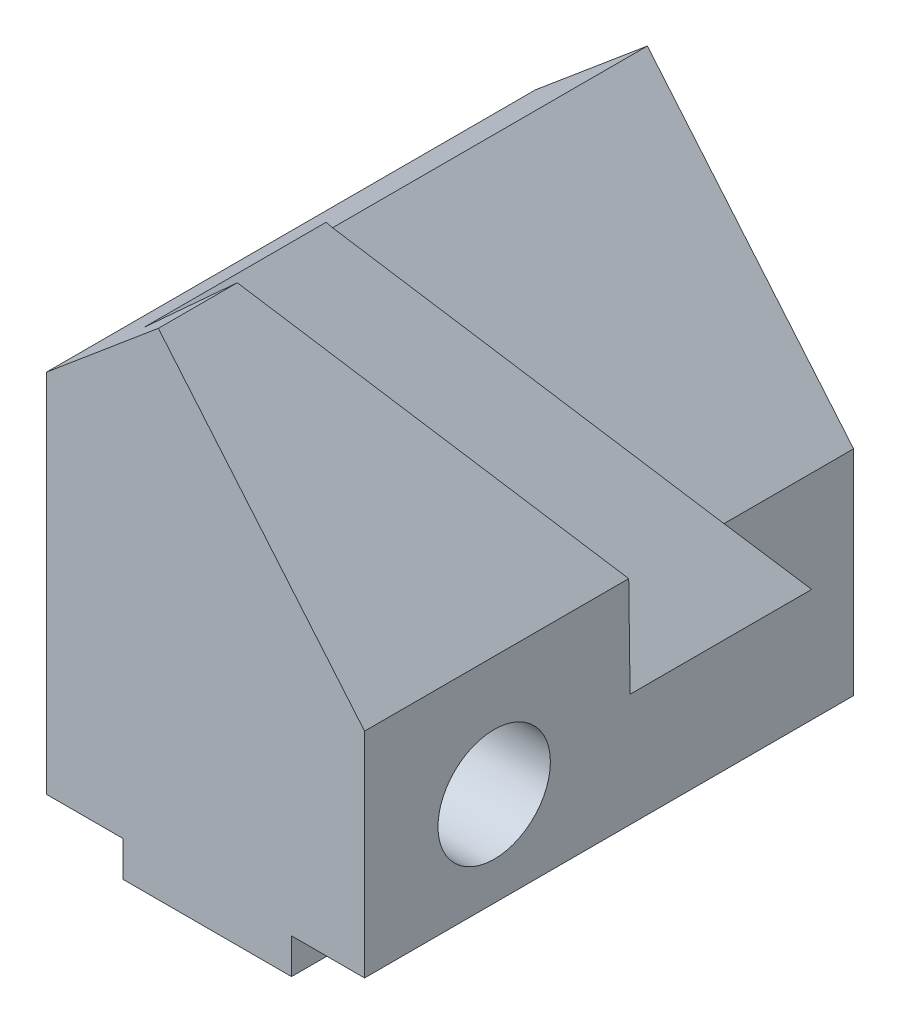
ISO-10303-21;
HEADER;
FILE_DESCRIPTION(('STEP AP214'),'2;1');
FILE_NAME('part.step','',(''),(''),'','','');
FILE_SCHEMA(('AUTOMOTIVE_DESIGN { 1 0 10303 214 1 1 1 1 }'));
ENDSEC;
DATA;
#1=APPLICATION_CONTEXT('core data for automotive mechanical design processes');
#2=APPLICATION_PROTOCOL_DEFINITION('international standard','automotive_design',2000,#1);
#3=PRODUCT_CONTEXT('',#1,'mechanical');
#4=PRODUCT('Part','Part','',(#3));
#5=PRODUCT_RELATED_PRODUCT_CATEGORY('part','',(#4));
#6=PRODUCT_DEFINITION_FORMATION('','',#4);
#7=PRODUCT_DEFINITION_CONTEXT('part definition',#1,'design');
#8=PRODUCT_DEFINITION('design','',#6,#7);
#9=PRODUCT_DEFINITION_SHAPE('','',#8);
#10=(LENGTH_UNIT() NAMED_UNIT(*) SI_UNIT(.MILLI.,.METRE.));
#11=(NAMED_UNIT(*) PLANE_ANGLE_UNIT() SI_UNIT($,.RADIAN.));
#12=(NAMED_UNIT(*) SI_UNIT($,.STERADIAN.) SOLID_ANGLE_UNIT());
#13=UNCERTAINTY_MEASURE_WITH_UNIT(LENGTH_MEASURE(1.E-05),#10,'distance_accuracy_value','');
#14=(GEOMETRIC_REPRESENTATION_CONTEXT(3) GLOBAL_UNCERTAINTY_ASSIGNED_CONTEXT((#13)) GLOBAL_UNIT_ASSIGNED_CONTEXT((#10,
#11,#12)) REPRESENTATION_CONTEXT('',''));
#15=CARTESIAN_POINT('',(0.,0.,0.));
#16=DIRECTION('',(0.,0.,1.));
#17=DIRECTION('',(1.,0.,0.));
#18=AXIS2_PLACEMENT_3D('',#15,#16,#17);
#19=CARTESIAN_POINT('',(-8.00000000000001,84.,0.));
#20=DIRECTION('',(-0.766044443118974,-0.642787609686544,0.));
#21=DIRECTION('',(0.642787609686544,-0.766044443118974,0.));
#22=AXIS2_PLACEMENT_3D('',#19,#20,#21);
#23=PLANE('',#22);
#24=DIRECTION('',(0.,0.,1.));
#25=VECTOR('',#24,1.);
#26=CARTESIAN_POINT('',(27.,42.2886242592031,0.));
#27=LINE('',#26,#25);
#28=CARTESIAN_POINT('',(27.,42.2886242592031,38.1658075373095));
#29=VERTEX_POINT('',#28);
#30=CARTESIAN_POINT('',(27.,42.2886242592031,83.));
#31=VERTEX_POINT('',#30);
#32=EDGE_CURVE('E170',#29,#31,#27,.T.);
#33=ORIENTED_EDGE('',*,*,#32,.F.);
#34=DIRECTION('',(-0.556670399226425,0.663413948168938,0.499999999999995));
#35=VECTOR('',#34,1.);
#36=CARTESIAN_POINT('',(11.3728876592962,60.91229153311,52.2020418713245));
#37=LINE('',#36,#35);
#38=CARTESIAN_POINT('',(-8.00000000000004,84.,69.6027224950989));
#39=VERTEX_POINT('',#38);
#40=EDGE_CURVE('E48',#29,#39,#37,.T.);
#41=ORIENTED_EDGE('',*,*,#40,.T.);
#42=DIRECTION('',(0.,0.,1.));
#43=VECTOR('',#42,1.);
#44=CARTESIAN_POINT('',(-8.00000000000001,84.,0.));
#45=LINE('',#44,#43);
#46=CARTESIAN_POINT('',(-8.00000000000001,84.,83.));
#47=VERTEX_POINT('',#46);
#48=EDGE_CURVE('E184',#39,#47,#45,.T.);
#49=ORIENTED_EDGE('',*,*,#48,.T.);
#50=DIRECTION('',(0.642787609686544,-0.766044443118974,0.));
#51=VECTOR('',#50,1.);
#52=CARTESIAN_POINT('',(-8.00000000000001,84.,83.));
#53=LINE('',#52,#51);
#54=EDGE_CURVE('E168',#47,#31,#53,.T.);
#55=ORIENTED_EDGE('',*,*,#54,.T.);
#56=EDGE_LOOP('',(#33,#41,#49,#55));
#57=FACE_BOUND('',#56,.T.);
#58=ADVANCED_FACE('F40',(#57),#23,.F.);
#59=CARTESIAN_POINT('',(14.6,0.,83.));
#60=DIRECTION('',(-1.,0.,0.));
#61=DIRECTION('',(0.,0.,1.));
#62=AXIS2_PLACEMENT_3D('',#59,#60,#61);
#63=PLANE('',#62);
#64=DIRECTION('',(0.,1.,0.));
#65=VECTOR('',#64,1.);
#66=CARTESIAN_POINT('',(14.6,0.,0.));
#67=LINE('',#66,#65);
#68=CARTESIAN_POINT('',(14.6,0.,0.));
#69=VERTEX_POINT('',#68);
#70=CARTESIAN_POINT('',(14.6,5.99999999999999,0.));
#71=VERTEX_POINT('',#70);
#72=EDGE_CURVE('E183',#69,#71,#67,.T.);
#73=ORIENTED_EDGE('',*,*,#72,.T.);
#74=DIRECTION('',(0.,0.,-1.));
#75=VECTOR('',#74,1.);
#76=CARTESIAN_POINT('',(14.6,5.99999999999999,83.));
#77=LINE('',#76,#75);
#78=CARTESIAN_POINT('',(14.6,5.99999999999999,83.));
#79=VERTEX_POINT('',#78);
#80=EDGE_CURVE('E231',#79,#71,#77,.T.);
#81=ORIENTED_EDGE('',*,*,#80,.F.);
#82=DIRECTION('',(0.,1.,0.));
#83=VECTOR('',#82,1.);
#84=CARTESIAN_POINT('',(14.6,0.,83.));
#85=LINE('',#84,#83);
#86=CARTESIAN_POINT('',(14.6,0.,83.));
#87=VERTEX_POINT('',#86);
#88=EDGE_CURVE('E186',#87,#79,#85,.T.);
#89=ORIENTED_EDGE('',*,*,#88,.F.);
#90=DIRECTION('',(0.,0.,-1.));
#91=VECTOR('',#90,1.);
#92=CARTESIAN_POINT('',(14.6,0.,83.));
#93=LINE('',#92,#91);
#94=EDGE_CURVE('E203',#87,#69,#93,.T.);
#95=ORIENTED_EDGE('',*,*,#94,.T.);
#96=EDGE_LOOP('',(#73,#81,#89,#95));
#97=FACE_BOUND('',#96,.T.);
#98=ADVANCED_FACE('F42',(#97),#63,.F.);
#99=CARTESIAN_POINT('',(14.6,5.99999999999999,83.));
#100=DIRECTION('',(0.,1.,0.));
#101=DIRECTION('',(-1.,0.,0.));
#102=AXIS2_PLACEMENT_3D('',#99,#100,#101);
#103=PLANE('',#102);
#104=DIRECTION('',(1.,0.,0.));
#105=VECTOR('',#104,1.);
#106=CARTESIAN_POINT('',(14.6,5.99999999999999,0.));
#107=LINE('',#106,#105);
#108=CARTESIAN_POINT('',(27.,6.00000000000001,0.));
#109=VERTEX_POINT('',#108);
#110=EDGE_CURVE('E206',#71,#109,#107,.T.);
#111=ORIENTED_EDGE('',*,*,#110,.T.);
#112=DIRECTION('',(0.,0.,-1.));
#113=VECTOR('',#112,1.);
#114=CARTESIAN_POINT('',(27.,6.00000000000001,83.));
#115=LINE('',#114,#113);
#116=CARTESIAN_POINT('',(27.,6.00000000000001,83.));
#117=VERTEX_POINT('',#116);
#118=EDGE_CURVE('E228',#117,#109,#115,.T.);
#119=ORIENTED_EDGE('',*,*,#118,.F.);
#120=DIRECTION('',(1.,0.,0.));
#121=VECTOR('',#120,1.);
#122=CARTESIAN_POINT('',(14.6,5.99999999999999,83.));
#123=LINE('',#122,#121);
#124=EDGE_CURVE('E189',#79,#117,#123,.T.);
#125=ORIENTED_EDGE('',*,*,#124,.F.);
#126=ORIENTED_EDGE('',*,*,#80,.T.);
#127=EDGE_LOOP('',(#111,#119,#125,#126));
#128=FACE_BOUND('',#127,.T.);
#129=ADVANCED_FACE('F274',(#128),#103,.F.);
#130=CARTESIAN_POINT('',(27.,6.00000000000001,83.));
#131=DIRECTION('',(-1.,0.,0.));
#132=DIRECTION('',(0.,-1.,0.));
#133=AXIS2_PLACEMENT_3D('',#130,#131,#132);
#134=PLANE('',#133);
#135=CARTESIAN_POINT('',(27.,22.,61.));
#136=DIRECTION('',(1.,0.,0.));
#137=DIRECTION('',(0.,0.,-1.));
#138=AXIS2_PLACEMENT_3D('',#135,#136,#137);
#139=CIRCLE('',#138,9.537499975);
#140=CARTESIAN_POINT('',(27.,22.,51.462500025));
#141=VERTEX_POINT('',#140);
#142=EDGE_CURVE('E145',#141,#141,#139,.T.);
#143=ORIENTED_EDGE('',*,*,#142,.F.);
#144=EDGE_LOOP('',(#143));
#145=FACE_BOUND('',#144,.T.);
#146=DIRECTION('',(0.,0.,1.));
#147=VECTOR('',#146,1.);
#148=CARTESIAN_POINT('',(27.,25.1756621637388,83.));
#149=LINE('',#148,#147);
#150=CARTESIAN_POINT('',(27.,25.1756621637388,7.0980148342552));
#151=VERTEX_POINT('',#150);
#152=CARTESIAN_POINT('',(27.,25.1756621637388,37.9304890382314));
#153=VERTEX_POINT('',#152);
#154=EDGE_CURVE('E138',#151,#153,#149,.T.);
#155=ORIENTED_EDGE('',*,*,#154,.T.);
#156=DIRECTION('',(0.,0.999905469885784,0.0137495924481631));
#157=VECTOR('',#156,1.);
#158=CARTESIAN_POINT('',(27.,6.62325401215735,37.6753768714329));
#159=LINE('',#158,#157);
#160=EDGE_CURVE('E146',#153,#29,#159,.T.);
#161=ORIENTED_EDGE('',*,*,#160,.T.);
#162=ORIENTED_EDGE('',*,*,#32,.T.);
#163=DIRECTION('',(0.,1.,0.));
#164=VECTOR('',#163,1.);
#165=CARTESIAN_POINT('',(27.,6.00000000000001,83.));
#166=LINE('',#165,#164);
#167=EDGE_CURVE('E192',#117,#31,#166,.T.);
#168=ORIENTED_EDGE('',*,*,#167,.F.);
#169=ORIENTED_EDGE('',*,*,#118,.T.);
#170=DIRECTION('',(0.,1.,0.));
#171=VECTOR('',#170,1.);
#172=CARTESIAN_POINT('',(27.,6.00000000000001,0.));
#173=LINE('',#172,#171);
#174=CARTESIAN_POINT('',(27.,42.2886242592031,0.));
#175=VERTEX_POINT('',#174);
#176=EDGE_CURVE('E208',#109,#175,#173,.T.);
#177=ORIENTED_EDGE('',*,*,#176,.T.);
#178=CARTESIAN_POINT('',(27.,42.2886242592031,22.));
#179=VERTEX_POINT('',#178);
#180=EDGE_CURVE('E155',#175,#179,#27,.T.);
#181=ORIENTED_EDGE('',*,*,#180,.T.);
#182=DIRECTION('',(0.,-0.754143856540743,-0.656709253507102));
#183=VECTOR('',#182,1.);
#184=CARTESIAN_POINT('',(27.,51.8605358951128,30.3352305936534));
#185=LINE('',#184,#183);
#186=EDGE_CURVE('E55',#179,#151,#185,.T.);
#187=ORIENTED_EDGE('',*,*,#186,.T.);
#188=EDGE_LOOP('',(#155,#161,#162,#168,#169,#177,#181,#187));
#189=FACE_BOUND('',#188,.T.);
#190=ADVANCED_FACE('F153',(#145,#189),#134,.F.);
#191=CARTESIAN_POINT('',(-27.,6.,83.));
#192=DIRECTION('',(1.,0.,0.));
#193=DIRECTION('',(0.,1.,0.));
#194=AXIS2_PLACEMENT_3D('',#191,#192,#193);
#195=PLANE('',#194);
#196=CARTESIAN_POINT('',(-27.,22.,61.));
#197=DIRECTION('',(1.,0.,0.));
#198=DIRECTION('',(0.,0.,-1.));
#199=AXIS2_PLACEMENT_3D('',#196,#197,#198);
#200=CIRCLE('',#199,9.53749997499999);
#201=CARTESIAN_POINT('',(-27.,22.,51.462500025));
#202=VERTEX_POINT('',#201);
#203=EDGE_CURVE('E165',#202,#202,#200,.T.);
#204=ORIENTED_EDGE('',*,*,#203,.T.);
#205=EDGE_LOOP('',(#204));
#206=FACE_BOUND('',#205,.T.);
#207=DIRECTION('',(0.,-1.,0.));
#208=VECTOR('',#207,1.);
#209=CARTESIAN_POINT('',(-27.,6.,83.));
#210=LINE('',#209,#208);
#211=CARTESIAN_POINT('',(-27.,68.0571070076319,83.));
#212=VERTEX_POINT('',#211);
#213=CARTESIAN_POINT('',(-27.,6.,83.));
#214=VERTEX_POINT('',#213);
#215=EDGE_CURVE('E195',#212,#214,#210,.T.);
#216=ORIENTED_EDGE('',*,*,#215,.F.);
#217=DIRECTION('',(0.,0.,1.));
#218=VECTOR('',#217,1.);
#219=CARTESIAN_POINT('',(-27.,68.0571070076319,0.));
#220=LINE('',#219,#218);
#221=CARTESIAN_POINT('',(-27.,68.0571070076319,0.));
#222=VERTEX_POINT('',#221);
#223=EDGE_CURVE('E178',#222,#212,#220,.T.);
#224=ORIENTED_EDGE('',*,*,#223,.F.);
#225=DIRECTION('',(0.,-1.,0.));
#226=VECTOR('',#225,1.);
#227=CARTESIAN_POINT('',(-27.,6.,0.));
#228=LINE('',#227,#226);
#229=CARTESIAN_POINT('',(-27.,6.,0.));
#230=VERTEX_POINT('',#229);
#231=EDGE_CURVE('E210',#222,#230,#228,.T.);
#232=ORIENTED_EDGE('',*,*,#231,.T.);
#233=DIRECTION('',(0.,0.,-1.));
#234=VECTOR('',#233,1.);
#235=CARTESIAN_POINT('',(-27.,6.,83.));
#236=LINE('',#235,#234);
#237=EDGE_CURVE('E225',#214,#230,#236,.T.);
#238=ORIENTED_EDGE('',*,*,#237,.F.);
#239=EDGE_LOOP('',(#216,#224,#232,#238));
#240=FACE_BOUND('',#239,.T.);
#241=ADVANCED_FACE('F250',(#206,#240),#195,.F.);
#242=CARTESIAN_POINT('',(-14.,6.,83.));
#243=DIRECTION('',(0.,1.,0.));
#244=DIRECTION('',(-1.,0.,0.));
#245=AXIS2_PLACEMENT_3D('',#242,#243,#244);
#246=PLANE('',#245);
#247=DIRECTION('',(1.,0.,0.));
#248=VECTOR('',#247,1.);
#249=CARTESIAN_POINT('',(-14.,6.,0.));
#250=LINE('',#249,#248);
#251=CARTESIAN_POINT('',(-14.,6.,0.));
#252=VERTEX_POINT('',#251);
#253=EDGE_CURVE('E212',#230,#252,#250,.T.);
#254=ORIENTED_EDGE('',*,*,#253,.T.);
#255=DIRECTION('',(0.,0.,-1.));
#256=VECTOR('',#255,1.);
#257=CARTESIAN_POINT('',(-14.,6.,83.));
#258=LINE('',#257,#256);
#259=CARTESIAN_POINT('',(-14.,6.,83.));
#260=VERTEX_POINT('',#259);
#261=EDGE_CURVE('E222',#260,#252,#258,.T.);
#262=ORIENTED_EDGE('',*,*,#261,.F.);
#263=DIRECTION('',(1.,0.,0.));
#264=VECTOR('',#263,1.);
#265=CARTESIAN_POINT('',(-14.,6.,83.));
#266=LINE('',#265,#264);
#267=EDGE_CURVE('E197',#214,#260,#266,.T.);
#268=ORIENTED_EDGE('',*,*,#267,.F.);
#269=ORIENTED_EDGE('',*,*,#237,.T.);
#270=EDGE_LOOP('',(#254,#262,#268,#269));
#271=FACE_BOUND('',#270,.T.);
#272=ADVANCED_FACE('F256',(#271),#246,.F.);
#273=CARTESIAN_POINT('',(-14.,0.,83.));
#274=DIRECTION('',(1.,0.,0.));
#275=DIRECTION('',(0.,0.,-1.));
#276=AXIS2_PLACEMENT_3D('',#273,#274,#275);
#277=PLANE('',#276);
#278=DIRECTION('',(0.,-1.,0.));
#279=VECTOR('',#278,1.);
#280=CARTESIAN_POINT('',(-14.,0.,0.));
#281=LINE('',#280,#279);
#282=CARTESIAN_POINT('',(-14.,0.,0.));
#283=VERTEX_POINT('',#282);
#284=EDGE_CURVE('E214',#252,#283,#281,.T.);
#285=ORIENTED_EDGE('',*,*,#284,.T.);
#286=DIRECTION('',(0.,0.,-1.));
#287=VECTOR('',#286,1.);
#288=CARTESIAN_POINT('',(-14.,0.,83.));
#289=LINE('',#288,#287);
#290=CARTESIAN_POINT('',(-14.,0.,83.));
#291=VERTEX_POINT('',#290);
#292=EDGE_CURVE('E219',#291,#283,#289,.T.);
#293=ORIENTED_EDGE('',*,*,#292,.F.);
#294=DIRECTION('',(0.,-1.,0.));
#295=VECTOR('',#294,1.);
#296=CARTESIAN_POINT('',(-14.,0.,83.));
#297=LINE('',#296,#295);
#298=EDGE_CURVE('E199',#260,#291,#297,.T.);
#299=ORIENTED_EDGE('',*,*,#298,.F.);
#300=ORIENTED_EDGE('',*,*,#261,.T.);
#301=EDGE_LOOP('',(#285,#293,#299,#300));
#302=FACE_BOUND('',#301,.T.);
#303=ADVANCED_FACE('F262',(#302),#277,.F.);
#304=CARTESIAN_POINT('',(14.6,0.,83.));
#305=DIRECTION('',(0.,1.,0.));
#306=DIRECTION('',(-1.,0.,0.));
#307=AXIS2_PLACEMENT_3D('',#304,#305,#306);
#308=PLANE('',#307);
#309=DIRECTION('',(1.,0.,0.));
#310=VECTOR('',#309,1.);
#311=CARTESIAN_POINT('',(14.6,0.,0.));
#312=LINE('',#311,#310);
#313=EDGE_CURVE('E190',#283,#69,#312,.T.);
#314=ORIENTED_EDGE('',*,*,#313,.T.);
#315=ORIENTED_EDGE('',*,*,#94,.F.);
#316=DIRECTION('',(1.,0.,0.));
#317=VECTOR('',#316,1.);
#318=CARTESIAN_POINT('',(14.6,0.,83.));
#319=LINE('',#318,#317);
#320=EDGE_CURVE('E201',#291,#87,#319,.T.);
#321=ORIENTED_EDGE('',*,*,#320,.F.);
#322=ORIENTED_EDGE('',*,*,#292,.T.);
#323=EDGE_LOOP('',(#314,#315,#321,#322));
#324=FACE_BOUND('',#323,.T.);
#325=ADVANCED_FACE('F266',(#324),#308,.F.);
#326=CARTESIAN_POINT('',(0.,0.,83.));
#327=DIRECTION('',(0.,0.,-1.));
#328=DIRECTION('',(-1.,0.,0.));
#329=AXIS2_PLACEMENT_3D('',#326,#327,#328);
#330=PLANE('',#329);
#331=ORIENTED_EDGE('',*,*,#167,.T.);
#332=ORIENTED_EDGE('',*,*,#54,.F.);
#333=DIRECTION('',(0.766044443118981,0.642787609686535,0.));
#334=VECTOR('',#333,1.);
#335=CARTESIAN_POINT('',(-8.00000000000001,84.,83.));
#336=LINE('',#335,#334);
#337=EDGE_CURVE('E174',#212,#47,#336,.T.);
#338=ORIENTED_EDGE('',*,*,#337,.F.);
#339=ORIENTED_EDGE('',*,*,#215,.T.);
#340=ORIENTED_EDGE('',*,*,#267,.T.);
#341=ORIENTED_EDGE('',*,*,#298,.T.);
#342=ORIENTED_EDGE('',*,*,#320,.T.);
#343=ORIENTED_EDGE('',*,*,#88,.T.);
#344=ORIENTED_EDGE('',*,*,#124,.T.);
#345=EDGE_LOOP('',(#331,#332,#338,#339,#340,#341,#342,#343,#344));
#346=FACE_BOUND('',#345,.T.);
#347=ADVANCED_FACE('F247',(#346),#330,.F.);
#348=CARTESIAN_POINT('',(0.,0.,0.));
#349=DIRECTION('',(0.,0.,-1.));
#350=DIRECTION('',(-1.,0.,0.));
#351=AXIS2_PLACEMENT_3D('',#348,#349,#350);
#352=PLANE('',#351);
#353=DIRECTION('',(0.642787609686544,-0.766044443118974,0.));
#354=VECTOR('',#353,1.);
#355=CARTESIAN_POINT('',(-8.00000000000001,84.,0.));
#356=LINE('',#355,#354);
#357=CARTESIAN_POINT('',(-8.00000000000001,84.,0.));
#358=VERTEX_POINT('',#357);
#359=EDGE_CURVE('E63',#358,#175,#356,.T.);
#360=ORIENTED_EDGE('',*,*,#359,.T.);
#361=ORIENTED_EDGE('',*,*,#176,.F.);
#362=ORIENTED_EDGE('',*,*,#110,.F.);
#363=ORIENTED_EDGE('',*,*,#72,.F.);
#364=ORIENTED_EDGE('',*,*,#313,.F.);
#365=ORIENTED_EDGE('',*,*,#284,.F.);
#366=ORIENTED_EDGE('',*,*,#253,.F.);
#367=ORIENTED_EDGE('',*,*,#231,.F.);
#368=DIRECTION('',(0.766044443118981,0.642787609686535,0.));
#369=VECTOR('',#368,1.);
#370=CARTESIAN_POINT('',(-8.00000000000001,84.,0.));
#371=LINE('',#370,#369);
#372=EDGE_CURVE('E175',#222,#358,#371,.T.);
#373=ORIENTED_EDGE('',*,*,#372,.T.);
#374=EDGE_LOOP('',(#360,#361,#362,#363,#364,#365,#366,#367,#373));
#375=FACE_BOUND('',#374,.T.);
#376=ADVANCED_FACE('F301',(#375),#352,.T.);
#377=CARTESIAN_POINT('',(-8.00000000000001,84.,0.));
#378=DIRECTION('',(0.642787609686535,-0.766044443118981,0.));
#379=DIRECTION('',(0.766044443118981,0.642787609686535,0.));
#380=AXIS2_PLACEMENT_3D('',#377,#378,#379);
#381=PLANE('',#380);
#382=ORIENTED_EDGE('',*,*,#48,.F.);
#383=DIRECTION('',(-0.637387504373015,-0.534831619836398,0.554700196225236));
#384=VECTOR('',#383,1.);
#385=CARTESIAN_POINT('',(16.60866713538,104.649123517062,48.1865001889141));
#386=LINE('',#385,#384);
#387=CARTESIAN_POINT('',(-16.4264888743088,76.9293362934481,76.9360558284324));
#388=VERTEX_POINT('',#387);
#389=EDGE_CURVE('E156',#39,#388,#386,.T.);
#390=ORIENTED_EDGE('',*,*,#389,.T.);
#391=DIRECTION('',(0.,0.,-1.));
#392=VECTOR('',#391,1.);
#393=CARTESIAN_POINT('',(-16.4264888743088,76.9293362934481,0.));
#394=LINE('',#393,#392);
#395=CARTESIAN_POINT('',(-16.4264888743088,76.9293362934481,46.1035816244562));
#396=VERTEX_POINT('',#395);
#397=EDGE_CURVE('E11',#388,#396,#394,.T.);
#398=ORIENTED_EDGE('',*,*,#397,.T.);
#399=DIRECTION('',(0.637387504373019,0.534831619836401,0.554700196225228));
#400=VECTOR('',#399,1.);
#401=CARTESIAN_POINT('',(-26.8931008126936,68.1468060762738,36.9947872784697));
#402=LINE('',#401,#400);
#403=CARTESIAN_POINT('',(-8.00000000000004,84.,53.4369149577895));
#404=VERTEX_POINT('',#403);
#405=EDGE_CURVE('E150',#396,#404,#402,.T.);
#406=ORIENTED_EDGE('',*,*,#405,.T.);
#407=EDGE_CURVE('E181',#358,#404,#45,.T.);
#408=ORIENTED_EDGE('',*,*,#407,.F.);
#409=ORIENTED_EDGE('',*,*,#372,.F.);
#410=ORIENTED_EDGE('',*,*,#223,.T.);
#411=ORIENTED_EDGE('',*,*,#337,.T.);
#412=EDGE_LOOP('',(#382,#390,#398,#406,#408,#409,#410,#411));
#413=FACE_BOUND('',#412,.T.);
#414=ADVANCED_FACE('F242',(#413),#381,.F.);
#415=ORIENTED_EDGE('',*,*,#407,.T.);
#416=DIRECTION('',(0.556670399226425,-0.663413948168937,-0.499999999999995));
#417=VECTOR('',#416,1.);
#418=CARTESIAN_POINT('',(6.87337439149043,66.2746026349428,40.0776862183424));
#419=LINE('',#418,#417);
#420=EDGE_CURVE('E234',#404,#179,#419,.T.);
#421=ORIENTED_EDGE('',*,*,#420,.T.);
#422=ORIENTED_EDGE('',*,*,#180,.F.);
#423=ORIENTED_EDGE('',*,*,#359,.F.);
#424=EDGE_LOOP('',(#415,#421,#422,#423));
#425=FACE_BOUND('',#424,.T.);
#426=ADVANCED_FACE('F289',(#425),#23,.F.);
#427=CARTESIAN_POINT('',(27.,22.,61.));
#428=DIRECTION('',(1.,0.,0.));
#429=DIRECTION('',(0.,0.,-1.));
#430=AXIS2_PLACEMENT_3D('',#427,#428,#429);
#431=CYLINDRICAL_SURFACE('',#430,9.53749997499999);
#432=ORIENTED_EDGE('',*,*,#203,.F.);
#433=EDGE_LOOP('',(#432));
#434=FACE_BOUND('',#433,.T.);
#435=ORIENTED_EDGE('',*,*,#142,.T.);
#436=EDGE_LOOP('',(#435));
#437=FACE_BOUND('',#436,.T.);
#438=ADVANCED_FACE('F285',(#434,#437),#431,.F.);
#439=CARTESIAN_POINT('',(38.2730726080248,11.74093738355,-3.02743159121514));
#440=DIRECTION('',(-0.766044443118974,-0.642787609686544,0.));
#441=DIRECTION('',(0.642787609686544,-0.766044443118974,0.));
#442=AXIS2_PLACEMENT_3D('',#439,#440,#441);
#443=PLANE('',#442);
#444=DIRECTION('',(-0.556670399226426,0.663413948168937,0.499999999999995));
#445=VECTOR('',#444,1.);
#446=CARTESIAN_POINT('',(38.2730726080248,11.74093738355,-3.02743159121514));
#447=LINE('',#446,#445);
#448=EDGE_CURVE('E140',#151,#396,#447,.T.);
#449=ORIENTED_EDGE('',*,*,#448,.T.);
#450=ORIENTED_EDGE('',*,*,#397,.F.);
#451=DIRECTION('',(-0.556670399226426,0.663413948168937,0.499999999999995));
#452=VECTOR('',#451,1.);
#453=CARTESIAN_POINT('',(46.8548354701577,1.51359066181173,20.0969240617672));
#454=LINE('',#453,#452);
#455=EDGE_CURVE('E142',#153,#388,#454,.T.);
#456=ORIENTED_EDGE('',*,*,#455,.F.);
#457=ORIENTED_EDGE('',*,*,#154,.F.);
#458=EDGE_LOOP('',(#449,#450,#456,#457));
#459=FACE_BOUND('',#458,.T.);
#460=ADVANCED_FACE('F139',(#459),#443,.F.);
#461=CARTESIAN_POINT('',(46.8548354701577,1.51359066181173,20.0969240617672));
#462=DIRECTION('',(0.661357421172698,-0.0103131692411884,0.75));
#463=DIRECTION('',(0.75003988872942,0.,-0.661392595448995));
#464=AXIS2_PLACEMENT_3D('',#461,#462,#463);
#465=PLANE('',#464);
#466=ORIENTED_EDGE('',*,*,#455,.T.);
#467=ORIENTED_EDGE('',*,*,#389,.F.);
#468=ORIENTED_EDGE('',*,*,#40,.F.);
#469=ORIENTED_EDGE('',*,*,#160,.F.);
#470=EDGE_LOOP('',(#466,#467,#468,#469));
#471=FACE_BOUND('',#470,.T.);
#472=ADVANCED_FACE('F276',(#471),#465,.F.);
#473=CARTESIAN_POINT('',(48.7406862794971,16.3790832801492,2.47256840878493));
#474=DIRECTION('',(0.104687021946282,0.653100778927738,-0.750000000000001));
#475=DIRECTION('',(0.,0.754143856540743,0.656709253507102));
#476=AXIS2_PLACEMENT_3D('',#473,#474,#475);
#477=PLANE('',#476);
#478=ORIENTED_EDGE('',*,*,#420,.F.);
#479=ORIENTED_EDGE('',*,*,#405,.F.);
#480=ORIENTED_EDGE('',*,*,#448,.F.);
#481=ORIENTED_EDGE('',*,*,#186,.F.);
#482=EDGE_LOOP('',(#478,#479,#480,#481));
#483=FACE_BOUND('',#482,.T.);
#484=ADVANCED_FACE('F148',(#483),#477,.F.);
#485=CLOSED_SHELL('',(#58,#98,#129,#190,#241,#272,#303,#325,#347,#376,#414,#426,#438,#460,#472,#484));
#486=MANIFOLD_SOLID_BREP('B2',#485);
#487=ADVANCED_BREP_SHAPE_REPRESENTATION('',(#18,#486),#14);
#488=SHAPE_DEFINITION_REPRESENTATION(#9,#487);
ENDSEC;
END-ISO-10303-21;
